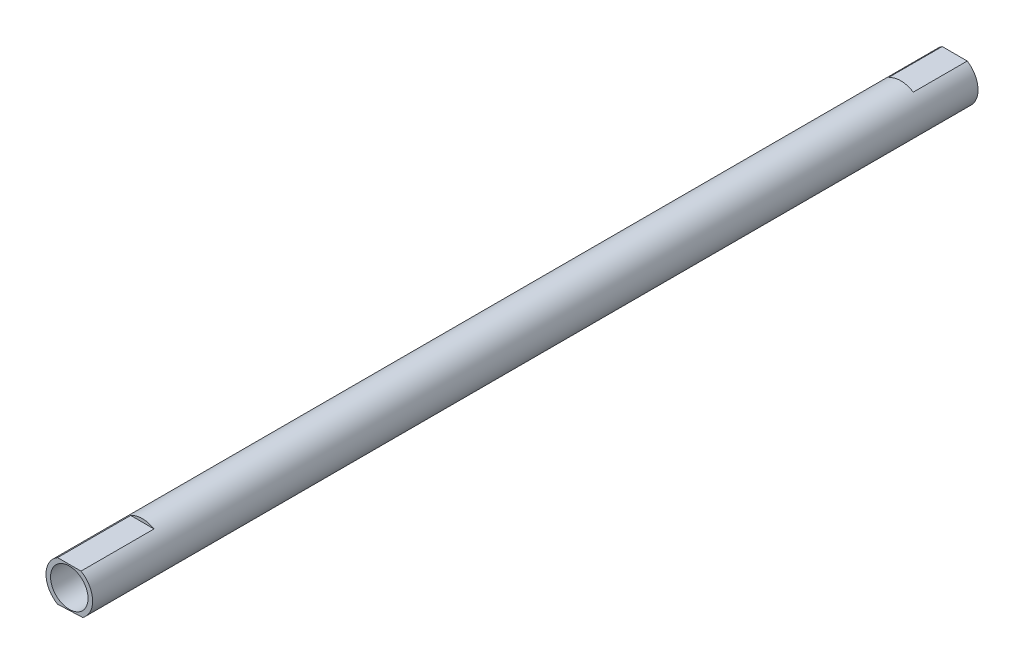
ISO-10303-21;
HEADER;
FILE_DESCRIPTION(('STEP AP214'),'2;1');
FILE_NAME('part.step','',(''),(''),'','','');
FILE_SCHEMA(('AUTOMOTIVE_DESIGN { 1 0 10303 214 1 1 1 1 }'));
ENDSEC;
DATA;
#1=APPLICATION_CONTEXT('core data for automotive mechanical design processes');
#2=APPLICATION_PROTOCOL_DEFINITION('international standard','automotive_design',2000,#1);
#3=PRODUCT_CONTEXT('',#1,'mechanical');
#4=PRODUCT('Part','Part','',(#3));
#5=PRODUCT_RELATED_PRODUCT_CATEGORY('part','',(#4));
#6=PRODUCT_DEFINITION_FORMATION('','',#4);
#7=PRODUCT_DEFINITION_CONTEXT('part definition',#1,'design');
#8=PRODUCT_DEFINITION('design','',#6,#7);
#9=PRODUCT_DEFINITION_SHAPE('','',#8);
#10=(LENGTH_UNIT() NAMED_UNIT(*) SI_UNIT(.MILLI.,.METRE.));
#11=(NAMED_UNIT(*) PLANE_ANGLE_UNIT() SI_UNIT($,.RADIAN.));
#12=(NAMED_UNIT(*) SI_UNIT($,.STERADIAN.) SOLID_ANGLE_UNIT());
#13=UNCERTAINTY_MEASURE_WITH_UNIT(LENGTH_MEASURE(1.E-05),#10,'distance_accuracy_value','');
#14=(GEOMETRIC_REPRESENTATION_CONTEXT(3) GLOBAL_UNCERTAINTY_ASSIGNED_CONTEXT((#13)) GLOBAL_UNIT_ASSIGNED_CONTEXT((#10,
#11,#12)) REPRESENTATION_CONTEXT('',''));
#15=CARTESIAN_POINT('',(0.,0.,0.));
#16=DIRECTION('',(0.,0.,1.));
#17=DIRECTION('',(1.,0.,0.));
#18=AXIS2_PLACEMENT_3D('',#15,#16,#17);
#19=CARTESIAN_POINT('',(0.,0.,508.));
#20=DIRECTION('',(0.,0.,-1.));
#21=DIRECTION('',(-1.,0.,0.));
#22=AXIS2_PLACEMENT_3D('',#19,#20,#21);
#23=CYLINDRICAL_SURFACE('',#22,13.3835651706087);
#24=DIRECTION('',(0.,0.,1.));
#25=VECTOR('',#24,1.);
#26=CARTESIAN_POINT('',(-6.70741416960576,-11.5814684661877,466.09));
#27=LINE('',#26,#25);
#28=CARTESIAN_POINT('',(-6.70741416960576,-11.5814684661877,466.09));
#29=VERTEX_POINT('',#28);
#30=CARTESIAN_POINT('',(-6.70741416960576,-11.5814684661877,508.));
#31=VERTEX_POINT('',#30);
#32=EDGE_CURVE('E140',#29,#31,#27,.T.);
#33=ORIENTED_EDGE('',*,*,#32,.T.);
#34=CARTESIAN_POINT('',(0.,0.,508.));
#35=DIRECTION('',(0.,0.,1.));
#36=DIRECTION('',(1.,0.,0.));
#37=AXIS2_PLACEMENT_3D('',#34,#35,#36);
#38=CIRCLE('',#37,13.3835651706087);
#39=CARTESIAN_POINT('',(-6.70741416960576,11.5814684661877,508.));
#40=VERTEX_POINT('',#39);
#41=EDGE_CURVE('E14',#40,#31,#38,.T.);
#42=ORIENTED_EDGE('',*,*,#41,.F.);
#43=DIRECTION('',(0.,0.,1.));
#44=VECTOR('',#43,1.);
#45=CARTESIAN_POINT('',(-6.70741416960576,11.5814684661877,466.09));
#46=LINE('',#45,#44);
#47=CARTESIAN_POINT('',(-6.70741416960576,11.5814684661877,466.09));
#48=VERTEX_POINT('',#47);
#49=EDGE_CURVE('E157',#48,#40,#46,.T.);
#50=ORIENTED_EDGE('',*,*,#49,.F.);
#51=CARTESIAN_POINT('',(0.,0.,466.09));
#52=DIRECTION('',(0.,0.,1.));
#53=DIRECTION('',(1.,0.,0.));
#54=AXIS2_PLACEMENT_3D('',#51,#52,#53);
#55=CIRCLE('',#54,13.3835651706087);
#56=CARTESIAN_POINT('',(6.70741416960576,11.5814684661877,466.09));
#57=VERTEX_POINT('',#56);
#58=EDGE_CURVE('E153',#57,#48,#55,.T.);
#59=ORIENTED_EDGE('',*,*,#58,.F.);
#60=DIRECTION('',(0.,0.,1.));
#61=VECTOR('',#60,1.);
#62=CARTESIAN_POINT('',(6.70741416960576,11.5814684661877,466.09));
#63=LINE('',#62,#61);
#64=CARTESIAN_POINT('',(6.70741416960576,11.5814684661877,508.));
#65=VERTEX_POINT('',#64);
#66=EDGE_CURVE('E160',#57,#65,#63,.T.);
#67=ORIENTED_EDGE('',*,*,#66,.T.);
#68=CARTESIAN_POINT('',(7.64808919377217,-10.9830118073338,508.));
#69=VERTEX_POINT('',#68);
#70=EDGE_CURVE('E54',#69,#65,#38,.T.);
#71=ORIENTED_EDGE('',*,*,#70,.F.);
#72=DIRECTION('',(0.,0.,1.));
#73=VECTOR('',#72,1.);
#74=CARTESIAN_POINT('',(7.64808919377217,-10.9830118073338,466.09));
#75=LINE('',#74,#73);
#76=CARTESIAN_POINT('',(7.64808919377217,-10.9830118073338,466.09));
#77=VERTEX_POINT('',#76);
#78=EDGE_CURVE('E138',#77,#69,#75,.T.);
#79=ORIENTED_EDGE('',*,*,#78,.F.);
#80=CARTESIAN_POINT('',(0.,0.,466.09));
#81=DIRECTION('',(0.,0.,1.));
#82=DIRECTION('',(1.,0.,0.));
#83=AXIS2_PLACEMENT_3D('',#80,#81,#82);
#84=CIRCLE('',#83,13.3835651706087);
#85=EDGE_CURVE('E143',#29,#77,#84,.T.);
#86=ORIENTED_EDGE('',*,*,#85,.F.);
#87=EDGE_LOOP('',(#33,#42,#50,#59,#67,#71,#79,#86));
#88=FACE_BOUND('',#87,.T.);
#89=DIRECTION('',(0.,0.,-1.));
#90=VECTOR('',#89,1.);
#91=CARTESIAN_POINT('',(-7.82008037784304,-10.8612227470024,30.988));
#92=LINE('',#91,#90);
#93=CARTESIAN_POINT('',(-7.82008037784304,-10.8612227470024,30.988));
#94=VERTEX_POINT('',#93);
#95=CARTESIAN_POINT('',(-7.82008037784304,-10.8612227470024,0.));
#96=VERTEX_POINT('',#95);
#97=EDGE_CURVE('E61',#94,#96,#92,.T.);
#98=ORIENTED_EDGE('',*,*,#97,.F.);
#99=CARTESIAN_POINT('',(0.,0.,30.988));
#100=DIRECTION('',(0.,0.,-1.));
#101=DIRECTION('',(-1.,0.,0.));
#102=AXIS2_PLACEMENT_3D('',#99,#100,#101);
#103=CIRCLE('',#102,13.3835651706087);
#104=CARTESIAN_POINT('',(7.19694643806851,-11.2837838796878,30.988));
#105=VERTEX_POINT('',#104);
#106=EDGE_CURVE('E117',#105,#94,#103,.T.);
#107=ORIENTED_EDGE('',*,*,#106,.F.);
#108=DIRECTION('',(0.,0.,-1.));
#109=VECTOR('',#108,1.);
#110=CARTESIAN_POINT('',(7.19694643806851,-11.2837838796878,30.988));
#111=LINE('',#110,#109);
#112=CARTESIAN_POINT('',(7.19694643806851,-11.2837838796878,0.));
#113=VERTEX_POINT('',#112);
#114=EDGE_CURVE('E110',#105,#113,#111,.T.);
#115=ORIENTED_EDGE('',*,*,#114,.T.);
#116=CARTESIAN_POINT('',(0.,0.,0.));
#117=DIRECTION('',(0.,0.,1.));
#118=DIRECTION('',(1.,0.,0.));
#119=AXIS2_PLACEMENT_3D('',#116,#117,#118);
#120=CIRCLE('',#119,13.3835651706087);
#121=CARTESIAN_POINT('',(7.19694643806852,11.2837838796878,0.));
#122=VERTEX_POINT('',#121);
#123=EDGE_CURVE('E69',#113,#122,#120,.T.);
#124=ORIENTED_EDGE('',*,*,#123,.T.);
#125=DIRECTION('',(0.,0.,-1.));
#126=VECTOR('',#125,1.);
#127=CARTESIAN_POINT('',(7.19694643806852,11.2837838796878,30.988));
#128=LINE('',#127,#126);
#129=CARTESIAN_POINT('',(7.19694643806852,11.2837838796878,30.988));
#130=VERTEX_POINT('',#129);
#131=EDGE_CURVE('E133',#130,#122,#128,.T.);
#132=ORIENTED_EDGE('',*,*,#131,.F.);
#133=CARTESIAN_POINT('',(0.,0.,30.988));
#134=DIRECTION('',(0.,0.,-1.));
#135=DIRECTION('',(-1.,0.,0.));
#136=AXIS2_PLACEMENT_3D('',#133,#134,#135);
#137=CIRCLE('',#136,13.3835651706087);
#138=CARTESIAN_POINT('',(-7.19694643806852,11.2837838796878,30.988));
#139=VERTEX_POINT('',#138);
#140=EDGE_CURVE('E128',#139,#130,#137,.T.);
#141=ORIENTED_EDGE('',*,*,#140,.F.);
#142=DIRECTION('',(0.,0.,-1.));
#143=VECTOR('',#142,1.);
#144=CARTESIAN_POINT('',(-7.19694643806852,11.2837838796878,30.988));
#145=LINE('',#144,#143);
#146=CARTESIAN_POINT('',(-7.19694643806852,11.2837838796878,0.));
#147=VERTEX_POINT('',#146);
#148=EDGE_CURVE('E135',#139,#147,#145,.T.);
#149=ORIENTED_EDGE('',*,*,#148,.T.);
#150=EDGE_CURVE('E49',#147,#96,#120,.T.);
#151=ORIENTED_EDGE('',*,*,#150,.T.);
#152=EDGE_LOOP('',(#98,#107,#115,#124,#132,#141,#149,#151));
#153=FACE_BOUND('',#152,.T.);
#154=ADVANCED_FACE('F46',(#88,#153),#23,.T.);
#155=CARTESIAN_POINT('',(0.,0.,0.));
#156=DIRECTION('',(0.,0.,1.));
#157=DIRECTION('',(1.,0.,0.));
#158=AXIS2_PLACEMENT_3D('',#155,#156,#157);
#159=PLANE('',#158);
#160=CARTESIAN_POINT('',(0.,0.,0.));
#161=DIRECTION('',(0.,0.,1.));
#162=DIRECTION('',(1.,0.,0.));
#163=AXIS2_PLACEMENT_3D('',#160,#161,#162);
#164=CIRCLE('',#163,10.7698699612986);
#165=CARTESIAN_POINT('',(10.7698699612986,0.,0.));
#166=VERTEX_POINT('',#165);
#167=EDGE_CURVE('E163',#166,#166,#164,.T.);
#168=ORIENTED_EDGE('',*,*,#167,.T.);
#169=EDGE_LOOP('',(#168));
#170=FACE_BOUND('',#169,.T.);
#171=DIRECTION('',(-0.999604338878108,0.0281276678034537,0.));
#172=VECTOR('',#171,1.);
#173=CARTESIAN_POINT('',(-0.311566969887262,-11.0725033133451,0.));
#174=LINE('',#173,#172);
#175=EDGE_CURVE('E115',#113,#96,#174,.T.);
#176=ORIENTED_EDGE('',*,*,#175,.T.);
#177=ORIENTED_EDGE('',*,*,#150,.F.);
#178=DIRECTION('',(-1.,0.,0.));
#179=VECTOR('',#178,1.);
#180=CARTESIAN_POINT('',(0.,11.2837838796878,0.));
#181=LINE('',#180,#179);
#182=EDGE_CURVE('E126',#122,#147,#181,.T.);
#183=ORIENTED_EDGE('',*,*,#182,.F.);
#184=ORIENTED_EDGE('',*,*,#123,.F.);
#185=EDGE_LOOP('',(#176,#177,#183,#184));
#186=FACE_BOUND('',#185,.T.);
#187=ADVANCED_FACE('F171',(#170,#186),#159,.F.);
#188=CARTESIAN_POINT('',(0.,0.,508.));
#189=DIRECTION('',(0.,0.,1.));
#190=DIRECTION('',(1.,0.,0.));
#191=AXIS2_PLACEMENT_3D('',#188,#189,#190);
#192=PLANE('',#191);
#193=CARTESIAN_POINT('',(0.,0.,508.));
#194=DIRECTION('',(0.,0.,1.));
#195=DIRECTION('',(1.,0.,0.));
#196=AXIS2_PLACEMENT_3D('',#193,#194,#195);
#197=CIRCLE('',#196,10.7698699612986);
#198=CARTESIAN_POINT('',(10.7698699612986,0.,508.));
#199=VERTEX_POINT('',#198);
#200=EDGE_CURVE('E165',#199,#199,#197,.T.);
#201=ORIENTED_EDGE('',*,*,#200,.F.);
#202=EDGE_LOOP('',(#201));
#203=FACE_BOUND('',#202,.T.);
#204=ORIENTED_EDGE('',*,*,#41,.T.);
#205=DIRECTION('',(0.999132173442851,0.0416521306941725,0.));
#206=VECTOR('',#205,1.);
#207=CARTESIAN_POINT('',(0.470337512083208,-11.2822401367608,508.));
#208=LINE('',#207,#206);
#209=EDGE_CURVE('E145',#31,#69,#208,.T.);
#210=ORIENTED_EDGE('',*,*,#209,.T.);
#211=ORIENTED_EDGE('',*,*,#70,.T.);
#212=DIRECTION('',(1.,0.,0.));
#213=VECTOR('',#212,1.);
#214=CARTESIAN_POINT('',(0.,11.5814684661877,508.));
#215=LINE('',#214,#213);
#216=EDGE_CURVE('E148',#40,#65,#215,.T.);
#217=ORIENTED_EDGE('',*,*,#216,.F.);
#218=EDGE_LOOP('',(#204,#210,#211,#217));
#219=FACE_BOUND('',#218,.T.);
#220=ADVANCED_FACE('F177',(#203,#219),#192,.T.);
#221=CARTESIAN_POINT('',(0.,0.,508.));
#222=DIRECTION('',(0.,0.,-1.));
#223=DIRECTION('',(-1.,0.,0.));
#224=AXIS2_PLACEMENT_3D('',#221,#222,#223);
#225=CYLINDRICAL_SURFACE('',#224,10.7698699612986);
#226=ORIENTED_EDGE('',*,*,#200,.T.);
#227=EDGE_LOOP('',(#226));
#228=FACE_BOUND('',#227,.T.);
#229=ORIENTED_EDGE('',*,*,#167,.F.);
#230=EDGE_LOOP('',(#229));
#231=FACE_BOUND('',#230,.T.);
#232=ADVANCED_FACE('F174',(#228,#231),#225,.F.);
#233=CARTESIAN_POINT('',(0.,11.5814684661877,466.09));
#234=DIRECTION('',(0.,-1.,0.));
#235=DIRECTION('',(0.,0.,-1.));
#236=AXIS2_PLACEMENT_3D('',#233,#234,#235);
#237=PLANE('',#236);
#238=ORIENTED_EDGE('',*,*,#216,.T.);
#239=ORIENTED_EDGE('',*,*,#66,.F.);
#240=DIRECTION('',(1.,0.,0.));
#241=VECTOR('',#240,1.);
#242=CARTESIAN_POINT('',(0.,11.5814684661877,466.09));
#243=LINE('',#242,#241);
#244=EDGE_CURVE('E155',#48,#57,#243,.T.);
#245=ORIENTED_EDGE('',*,*,#244,.F.);
#246=ORIENTED_EDGE('',*,*,#49,.T.);
#247=EDGE_LOOP('',(#238,#239,#245,#246));
#248=FACE_BOUND('',#247,.T.);
#249=ADVANCED_FACE('F176',(#248),#237,.F.);
#250=CARTESIAN_POINT('',(0.,0.,466.09));
#251=DIRECTION('',(0.,0.,1.));
#252=DIRECTION('',(1.,0.,0.));
#253=AXIS2_PLACEMENT_3D('',#250,#251,#252);
#254=PLANE('',#253);
#255=ORIENTED_EDGE('',*,*,#58,.T.);
#256=ORIENTED_EDGE('',*,*,#244,.T.);
#257=EDGE_LOOP('',(#255,#256));
#258=FACE_BOUND('',#257,.T.);
#259=ADVANCED_FACE('F184',(#258),#254,.T.);
#260=CARTESIAN_POINT('',(0.470337512083208,-11.2822401367608,466.09));
#261=DIRECTION('',(0.0416521306941725,-0.999132173442851,0.));
#262=DIRECTION('',(0.999132173442851,0.0416521306941725,0.));
#263=AXIS2_PLACEMENT_3D('',#260,#261,#262);
#264=PLANE('',#263);
#265=ORIENTED_EDGE('',*,*,#209,.F.);
#266=ORIENTED_EDGE('',*,*,#32,.F.);
#267=DIRECTION('',(0.999132173442851,0.0416521306941725,0.));
#268=VECTOR('',#267,1.);
#269=CARTESIAN_POINT('',(0.470337512083208,-11.2822401367608,466.09));
#270=LINE('',#269,#268);
#271=EDGE_CURVE('E149',#29,#77,#270,.T.);
#272=ORIENTED_EDGE('',*,*,#271,.T.);
#273=ORIENTED_EDGE('',*,*,#78,.T.);
#274=EDGE_LOOP('',(#265,#266,#272,#273));
#275=FACE_BOUND('',#274,.T.);
#276=ADVANCED_FACE('F208',(#275),#264,.T.);
#277=CARTESIAN_POINT('',(0.,0.,466.09));
#278=DIRECTION('',(0.,0.,1.));
#279=DIRECTION('',(1.,0.,0.));
#280=AXIS2_PLACEMENT_3D('',#277,#278,#279);
#281=PLANE('',#280);
#282=ORIENTED_EDGE('',*,*,#271,.F.);
#283=ORIENTED_EDGE('',*,*,#85,.T.);
#284=EDGE_LOOP('',(#282,#283));
#285=FACE_BOUND('',#284,.T.);
#286=ADVANCED_FACE('F213',(#285),#281,.T.);
#287=CARTESIAN_POINT('',(0.,11.2837838796878,30.988));
#288=DIRECTION('',(0.,-1.,0.));
#289=DIRECTION('',(0.,0.,-1.));
#290=AXIS2_PLACEMENT_3D('',#287,#288,#289);
#291=PLANE('',#290);
#292=ORIENTED_EDGE('',*,*,#182,.T.);
#293=ORIENTED_EDGE('',*,*,#148,.F.);
#294=DIRECTION('',(-1.,0.,0.));
#295=VECTOR('',#294,1.);
#296=CARTESIAN_POINT('',(0.,11.2837838796878,30.988));
#297=LINE('',#296,#295);
#298=EDGE_CURVE('E130',#130,#139,#297,.T.);
#299=ORIENTED_EDGE('',*,*,#298,.F.);
#300=ORIENTED_EDGE('',*,*,#131,.T.);
#301=EDGE_LOOP('',(#292,#293,#299,#300));
#302=FACE_BOUND('',#301,.T.);
#303=ADVANCED_FACE('F217',(#302),#291,.F.);
#304=CARTESIAN_POINT('',(0.,0.,30.988));
#305=DIRECTION('',(0.,0.,-1.));
#306=DIRECTION('',(-1.,0.,0.));
#307=AXIS2_PLACEMENT_3D('',#304,#305,#306);
#308=PLANE('',#307);
#309=ORIENTED_EDGE('',*,*,#140,.T.);
#310=ORIENTED_EDGE('',*,*,#298,.T.);
#311=EDGE_LOOP('',(#309,#310));
#312=FACE_BOUND('',#311,.T.);
#313=ADVANCED_FACE('F222',(#312),#308,.T.);
#314=CARTESIAN_POINT('',(-0.311566969887262,-11.0725033133451,30.988));
#315=DIRECTION('',(-0.0281276678034537,-0.999604338878108,0.));
#316=DIRECTION('',(0.999604338878108,-0.0281276678034537,0.));
#317=AXIS2_PLACEMENT_3D('',#314,#315,#316);
#318=PLANE('',#317);
#319=ORIENTED_EDGE('',*,*,#175,.F.);
#320=ORIENTED_EDGE('',*,*,#114,.F.);
#321=DIRECTION('',(-0.999604338878108,0.0281276678034537,0.));
#322=VECTOR('',#321,1.);
#323=CARTESIAN_POINT('',(-0.311566969887262,-11.0725033133451,30.988));
#324=LINE('',#323,#322);
#325=EDGE_CURVE('E113',#105,#94,#324,.T.);
#326=ORIENTED_EDGE('',*,*,#325,.T.);
#327=ORIENTED_EDGE('',*,*,#97,.T.);
#328=EDGE_LOOP('',(#319,#320,#326,#327));
#329=FACE_BOUND('',#328,.T.);
#330=ADVANCED_FACE('F112',(#329),#318,.T.);
#331=CARTESIAN_POINT('',(0.,0.,30.988));
#332=DIRECTION('',(0.,0.,-1.));
#333=DIRECTION('',(-1.,0.,0.));
#334=AXIS2_PLACEMENT_3D('',#331,#332,#333);
#335=PLANE('',#334);
#336=ORIENTED_EDGE('',*,*,#325,.F.);
#337=ORIENTED_EDGE('',*,*,#106,.T.);
#338=EDGE_LOOP('',(#336,#337));
#339=FACE_BOUND('',#338,.T.);
#340=ADVANCED_FACE('F120',(#339),#335,.T.);
#341=CLOSED_SHELL('',(#154,#187,#220,#232,#249,#259,#276,#286,#303,#313,#330,#340));
#342=MANIFOLD_SOLID_BREP('B2',#341);
#343=ADVANCED_BREP_SHAPE_REPRESENTATION('',(#18,#342),#14);
#344=SHAPE_DEFINITION_REPRESENTATION(#9,#343);
ENDSEC;
END-ISO-10303-21;
